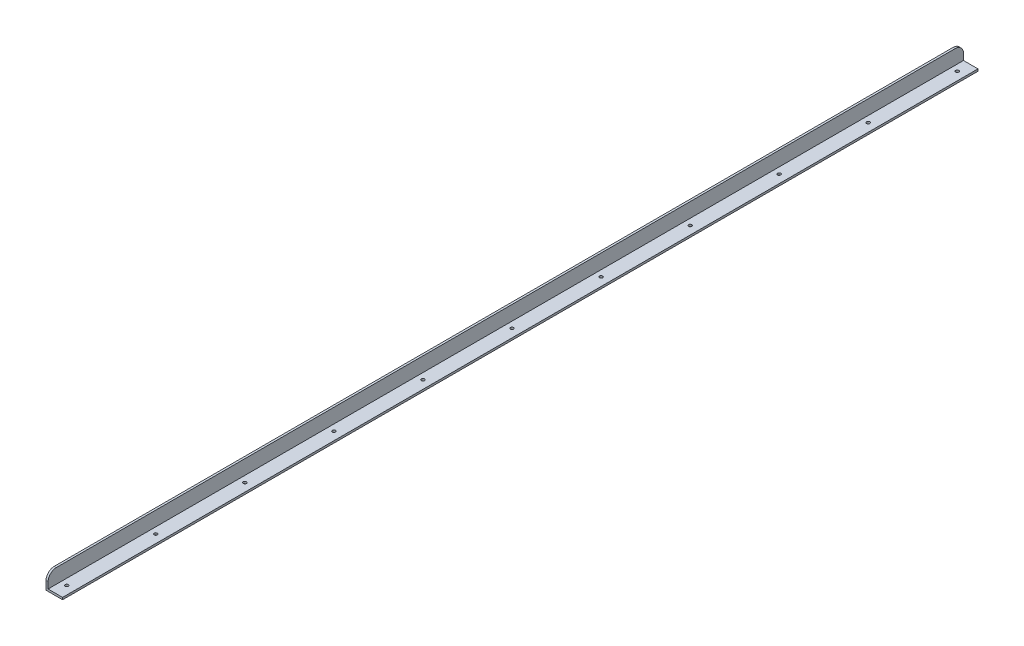
ISO-10303-21;
HEADER;
FILE_DESCRIPTION(('STEP AP214'),'2;1');
FILE_NAME('part.step','',(''),(''),'','','');
FILE_SCHEMA(('AUTOMOTIVE_DESIGN { 1 0 10303 214 1 1 1 1 }'));
ENDSEC;
DATA;
#1=APPLICATION_CONTEXT('core data for automotive mechanical design processes');
#2=APPLICATION_PROTOCOL_DEFINITION('international standard','automotive_design',2000,#1);
#3=PRODUCT_CONTEXT('',#1,'mechanical');
#4=PRODUCT('Part','Part','',(#3));
#5=PRODUCT_RELATED_PRODUCT_CATEGORY('part','',(#4));
#6=PRODUCT_DEFINITION_FORMATION('','',#4);
#7=PRODUCT_DEFINITION_CONTEXT('part definition',#1,'design');
#8=PRODUCT_DEFINITION('design','',#6,#7);
#9=PRODUCT_DEFINITION_SHAPE('','',#8);
#10=(LENGTH_UNIT() NAMED_UNIT(*) SI_UNIT(.MILLI.,.METRE.));
#11=(NAMED_UNIT(*) PLANE_ANGLE_UNIT() SI_UNIT($,.RADIAN.));
#12=(NAMED_UNIT(*) SI_UNIT($,.STERADIAN.) SOLID_ANGLE_UNIT());
#13=UNCERTAINTY_MEASURE_WITH_UNIT(LENGTH_MEASURE(1.E-05),#10,'distance_accuracy_value','');
#14=(GEOMETRIC_REPRESENTATION_CONTEXT(3) GLOBAL_UNCERTAINTY_ASSIGNED_CONTEXT((#13)) GLOBAL_UNIT_ASSIGNED_CONTEXT((#10,
#11,#12)) REPRESENTATION_CONTEXT('',''));
#15=CARTESIAN_POINT('',(0.,0.,0.));
#16=DIRECTION('',(0.,0.,1.));
#17=DIRECTION('',(1.,0.,0.));
#18=AXIS2_PLACEMENT_3D('',#15,#16,#17);
#19=CARTESIAN_POINT('',(25.4000000000001,3.17500000000001,-1403.35));
#20=DIRECTION('',(0.,1.,0.));
#21=DIRECTION('',(-1.,0.,0.));
#22=AXIS2_PLACEMENT_3D('',#19,#20,#21);
#23=PLANE('',#22);
#24=CARTESIAN_POINT('',(12.7,3.17500000000003,-19.05));
#25=DIRECTION('',(0.,1.,0.));
#26=DIRECTION('',(-1.,0.,0.));
#27=AXIS2_PLACEMENT_3D('',#24,#25,#26);
#28=CIRCLE('',#27,2.4257);
#29=CARTESIAN_POINT('',(10.2743,3.17500000000002,-19.05));
#30=VERTEX_POINT('',#29);
#31=EDGE_CURVE('E109',#30,#30,#28,.F.);
#32=ORIENTED_EDGE('',*,*,#31,.T.);
#33=EDGE_LOOP('',(#32));
#34=FACE_BOUND('',#33,.T.);
#35=DIRECTION('',(-1.,0.,0.));
#36=VECTOR('',#35,1.);
#37=CARTESIAN_POINT('',(25.4,3.17500000000001,1.11022302462516E-13));
#38=LINE('',#37,#36);
#39=CARTESIAN_POINT('',(25.4,3.17500000000001,1.11022302462516E-13));
#40=VERTEX_POINT('',#39);
#41=CARTESIAN_POINT('',(3.17499999999998,3.175,1.11022302462516E-13));
#42=VERTEX_POINT('',#41);
#43=EDGE_CURVE('E127',#40,#42,#38,.T.);
#44=ORIENTED_EDGE('',*,*,#43,.F.);
#45=DIRECTION('',(0.,0.,1.));
#46=VECTOR('',#45,1.);
#47=CARTESIAN_POINT('',(25.4000000000001,3.17500000000001,-1403.35));
#48=LINE('',#47,#46);
#49=CARTESIAN_POINT('',(25.4000000000001,3.17500000000001,-1403.35));
#50=VERTEX_POINT('',#49);
#51=EDGE_CURVE('E153',#50,#40,#48,.T.);
#52=ORIENTED_EDGE('',*,*,#51,.F.);
#53=DIRECTION('',(-1.,0.,0.));
#54=VECTOR('',#53,1.);
#55=CARTESIAN_POINT('',(25.4000000000001,3.17500000000001,-1403.35));
#56=LINE('',#55,#54);
#57=CARTESIAN_POINT('',(3.17500000000009,3.17500000000004,-1403.35));
#58=VERTEX_POINT('',#57);
#59=EDGE_CURVE('E141',#50,#58,#56,.T.);
#60=ORIENTED_EDGE('',*,*,#59,.T.);
#61=DIRECTION('',(0.,0.,1.));
#62=VECTOR('',#61,1.);
#63=CARTESIAN_POINT('',(3.17500000000009,3.17500000000004,-1403.35));
#64=LINE('',#63,#62);
#65=EDGE_CURVE('E151',#58,#42,#64,.T.);
#66=ORIENTED_EDGE('',*,*,#65,.T.);
#67=EDGE_LOOP('',(#44,#52,#60,#66));
#68=FACE_BOUND('',#67,.T.);
#69=CARTESIAN_POINT('',(12.7,3.17499999999998,-155.575));
#70=DIRECTION('',(0.,1.,0.));
#71=DIRECTION('',(-1.,0.,0.));
#72=AXIS2_PLACEMENT_3D('',#69,#70,#71);
#73=CIRCLE('',#72,2.4257);
#74=CARTESIAN_POINT('',(10.2743,3.17499999999998,-155.575));
#75=VERTEX_POINT('',#74);
#76=EDGE_CURVE('E242',#75,#75,#73,.F.);
#77=ORIENTED_EDGE('',*,*,#76,.T.);
#78=EDGE_LOOP('',(#77));
#79=FACE_BOUND('',#78,.T.);
#80=CARTESIAN_POINT('',(12.7,3.175,-292.1));
#81=DIRECTION('',(0.,1.,0.));
#82=DIRECTION('',(-1.,0.,0.));
#83=AXIS2_PLACEMENT_3D('',#80,#81,#82);
#84=CIRCLE('',#83,2.4257);
#85=CARTESIAN_POINT('',(10.2743,3.175,-292.1));
#86=VERTEX_POINT('',#85);
#87=EDGE_CURVE('E148',#86,#86,#84,.F.);
#88=ORIENTED_EDGE('',*,*,#87,.T.);
#89=EDGE_LOOP('',(#88));
#90=FACE_BOUND('',#89,.T.);
#91=CARTESIAN_POINT('',(12.7,3.175,-428.625));
#92=DIRECTION('',(0.,1.,0.));
#93=DIRECTION('',(-1.,0.,0.));
#94=AXIS2_PLACEMENT_3D('',#91,#92,#93);
#95=CIRCLE('',#94,2.4257);
#96=CARTESIAN_POINT('',(10.2743,3.175,-428.625));
#97=VERTEX_POINT('',#96);
#98=EDGE_CURVE('E161',#97,#97,#95,.F.);
#99=ORIENTED_EDGE('',*,*,#98,.T.);
#100=EDGE_LOOP('',(#99));
#101=FACE_BOUND('',#100,.T.);
#102=CARTESIAN_POINT('',(12.7,3.17499999999998,-565.15));
#103=DIRECTION('',(0.,1.,0.));
#104=DIRECTION('',(-1.,0.,0.));
#105=AXIS2_PLACEMENT_3D('',#102,#103,#104);
#106=CIRCLE('',#105,2.4257);
#107=CARTESIAN_POINT('',(10.2743,3.17499999999998,-565.15));
#108=VERTEX_POINT('',#107);
#109=EDGE_CURVE('E167',#108,#108,#106,.F.);
#110=ORIENTED_EDGE('',*,*,#109,.T.);
#111=EDGE_LOOP('',(#110));
#112=FACE_BOUND('',#111,.T.);
#113=CARTESIAN_POINT('',(12.7,3.175,-701.675));
#114=DIRECTION('',(0.,1.,0.));
#115=DIRECTION('',(-1.,0.,0.));
#116=AXIS2_PLACEMENT_3D('',#113,#114,#115);
#117=CIRCLE('',#116,2.4257);
#118=CARTESIAN_POINT('',(10.2743,3.175,-701.675));
#119=VERTEX_POINT('',#118);
#120=EDGE_CURVE('E173',#119,#119,#117,.F.);
#121=ORIENTED_EDGE('',*,*,#120,.T.);
#122=EDGE_LOOP('',(#121));
#123=FACE_BOUND('',#122,.T.);
#124=CARTESIAN_POINT('',(12.7,3.17499999999998,-838.2));
#125=DIRECTION('',(0.,1.,0.));
#126=DIRECTION('',(-1.,0.,0.));
#127=AXIS2_PLACEMENT_3D('',#124,#125,#126);
#128=CIRCLE('',#127,2.4257);
#129=CARTESIAN_POINT('',(10.2743,3.17499999999998,-838.2));
#130=VERTEX_POINT('',#129);
#131=EDGE_CURVE('E179',#130,#130,#128,.F.);
#132=ORIENTED_EDGE('',*,*,#131,.T.);
#133=EDGE_LOOP('',(#132));
#134=FACE_BOUND('',#133,.T.);
#135=CARTESIAN_POINT('',(12.7,3.17499999999998,-974.725));
#136=DIRECTION('',(0.,1.,0.));
#137=DIRECTION('',(-1.,0.,0.));
#138=AXIS2_PLACEMENT_3D('',#135,#136,#137);
#139=CIRCLE('',#138,2.4257);
#140=CARTESIAN_POINT('',(10.2743,3.17499999999998,-974.725));
#141=VERTEX_POINT('',#140);
#142=EDGE_CURVE('E185',#141,#141,#139,.F.);
#143=ORIENTED_EDGE('',*,*,#142,.T.);
#144=EDGE_LOOP('',(#143));
#145=FACE_BOUND('',#144,.T.);
#146=CARTESIAN_POINT('',(12.7000000000001,3.17500000000007,-1111.25));
#147=DIRECTION('',(0.,1.,0.));
#148=DIRECTION('',(-1.,0.,0.));
#149=AXIS2_PLACEMENT_3D('',#146,#147,#148);
#150=CIRCLE('',#149,2.4257);
#151=CARTESIAN_POINT('',(10.2743000000001,3.17500000000007,-1111.25));
#152=VERTEX_POINT('',#151);
#153=EDGE_CURVE('E191',#152,#152,#150,.F.);
#154=ORIENTED_EDGE('',*,*,#153,.T.);
#155=EDGE_LOOP('',(#154));
#156=FACE_BOUND('',#155,.T.);
#157=CARTESIAN_POINT('',(12.7000000000001,3.17500000000007,-1247.775));
#158=DIRECTION('',(0.,1.,0.));
#159=DIRECTION('',(-1.,0.,0.));
#160=AXIS2_PLACEMENT_3D('',#157,#158,#159);
#161=CIRCLE('',#160,2.4257);
#162=CARTESIAN_POINT('',(10.2743000000001,3.17500000000007,-1247.775));
#163=VERTEX_POINT('',#162);
#164=EDGE_CURVE('E197',#163,#163,#161,.F.);
#165=ORIENTED_EDGE('',*,*,#164,.T.);
#166=EDGE_LOOP('',(#165));
#167=FACE_BOUND('',#166,.T.);
#168=CARTESIAN_POINT('',(12.7000000000001,3.17500000000004,-1384.3));
#169=DIRECTION('',(0.,1.,0.));
#170=DIRECTION('',(-1.,0.,0.));
#171=AXIS2_PLACEMENT_3D('',#168,#169,#170);
#172=CIRCLE('',#171,2.4257);
#173=CARTESIAN_POINT('',(10.2743000000001,3.17500000000004,-1384.3));
#174=VERTEX_POINT('',#173);
#175=EDGE_CURVE('E203',#174,#174,#172,.F.);
#176=ORIENTED_EDGE('',*,*,#175,.T.);
#177=EDGE_LOOP('',(#176));
#178=FACE_BOUND('',#177,.T.);
#179=ADVANCED_FACE('F32',(#34,#68,#79,#90,#101,#112,#123,#134,#145,#156,#167,#178),#23,.T.);
#180=CARTESIAN_POINT('',(0.,0.,-1403.35));
#181=DIRECTION('',(0.,-1.,0.));
#182=DIRECTION('',(0.,0.,-1.));
#183=AXIS2_PLACEMENT_3D('',#180,#181,#182);
#184=PLANE('',#183);
#185=CARTESIAN_POINT('',(12.7,0.,-19.05));
#186=DIRECTION('',(0.,1.,0.));
#187=DIRECTION('',(0.,0.,1.));
#188=AXIS2_PLACEMENT_3D('',#185,#186,#187);
#189=CIRCLE('',#188,2.4257);
#190=CARTESIAN_POINT('',(12.7,0.,-16.6243));
#191=VERTEX_POINT('',#190);
#192=EDGE_CURVE('E458',#191,#191,#189,.T.);
#193=ORIENTED_EDGE('',*,*,#192,.T.);
#194=EDGE_LOOP('',(#193));
#195=FACE_BOUND('',#194,.T.);
#196=DIRECTION('',(1.,0.,0.));
#197=VECTOR('',#196,1.);
#198=CARTESIAN_POINT('',(0.,0.,0.));
#199=LINE('',#198,#197);
#200=CARTESIAN_POINT('',(0.,0.,0.));
#201=VERTEX_POINT('',#200);
#202=CARTESIAN_POINT('',(25.4,0.,1.11022302462516E-13));
#203=VERTEX_POINT('',#202);
#204=EDGE_CURVE('E106',#201,#203,#199,.T.);
#205=ORIENTED_EDGE('',*,*,#204,.F.);
#206=DIRECTION('',(0.,0.,1.));
#207=VECTOR('',#206,1.);
#208=CARTESIAN_POINT('',(0.,0.,-1403.35));
#209=LINE('',#208,#207);
#210=CARTESIAN_POINT('',(0.,0.,-1403.35));
#211=VERTEX_POINT('',#210);
#212=EDGE_CURVE('E112',#211,#201,#209,.T.);
#213=ORIENTED_EDGE('',*,*,#212,.F.);
#214=DIRECTION('',(1.,0.,0.));
#215=VECTOR('',#214,1.);
#216=CARTESIAN_POINT('',(0.,0.,-1403.35));
#217=LINE('',#216,#215);
#218=CARTESIAN_POINT('',(25.4000000000001,0.,-1403.35));
#219=VERTEX_POINT('',#218);
#220=EDGE_CURVE('E136',#211,#219,#217,.T.);
#221=ORIENTED_EDGE('',*,*,#220,.T.);
#222=DIRECTION('',(0.,0.,1.));
#223=VECTOR('',#222,1.);
#224=CARTESIAN_POINT('',(25.4000000000001,0.,-1403.35));
#225=LINE('',#224,#223);
#226=EDGE_CURVE('E119',#219,#203,#225,.T.);
#227=ORIENTED_EDGE('',*,*,#226,.T.);
#228=EDGE_LOOP('',(#205,#213,#221,#227));
#229=FACE_BOUND('',#228,.T.);
#230=CARTESIAN_POINT('',(12.7,0.,-155.575));
#231=DIRECTION('',(0.,1.,0.));
#232=DIRECTION('',(0.,0.,1.));
#233=AXIS2_PLACEMENT_3D('',#230,#231,#232);
#234=CIRCLE('',#233,2.4257);
#235=CARTESIAN_POINT('',(12.7,0.,-153.1493));
#236=VERTEX_POINT('',#235);
#237=EDGE_CURVE('E459',#236,#236,#234,.T.);
#238=ORIENTED_EDGE('',*,*,#237,.T.);
#239=EDGE_LOOP('',(#238));
#240=FACE_BOUND('',#239,.T.);
#241=CARTESIAN_POINT('',(12.7,0.,-292.1));
#242=DIRECTION('',(0.,1.,0.));
#243=DIRECTION('',(0.,0.,1.));
#244=AXIS2_PLACEMENT_3D('',#241,#242,#243);
#245=CIRCLE('',#244,2.4257);
#246=CARTESIAN_POINT('',(12.7,0.,-289.6743));
#247=VERTEX_POINT('',#246);
#248=EDGE_CURVE('E158',#247,#247,#245,.T.);
#249=ORIENTED_EDGE('',*,*,#248,.T.);
#250=EDGE_LOOP('',(#249));
#251=FACE_BOUND('',#250,.T.);
#252=CARTESIAN_POINT('',(12.7,0.,-428.625));
#253=DIRECTION('',(0.,1.,0.));
#254=DIRECTION('',(0.,0.,1.));
#255=AXIS2_PLACEMENT_3D('',#252,#253,#254);
#256=CIRCLE('',#255,2.4257);
#257=CARTESIAN_POINT('',(12.7,0.,-426.1993));
#258=VERTEX_POINT('',#257);
#259=EDGE_CURVE('E164',#258,#258,#256,.T.);
#260=ORIENTED_EDGE('',*,*,#259,.T.);
#261=EDGE_LOOP('',(#260));
#262=FACE_BOUND('',#261,.T.);
#263=CARTESIAN_POINT('',(12.7,0.,-565.15));
#264=DIRECTION('',(0.,1.,0.));
#265=DIRECTION('',(0.,0.,1.));
#266=AXIS2_PLACEMENT_3D('',#263,#264,#265);
#267=CIRCLE('',#266,2.4257);
#268=CARTESIAN_POINT('',(12.7,0.,-562.7243));
#269=VERTEX_POINT('',#268);
#270=EDGE_CURVE('E170',#269,#269,#267,.T.);
#271=ORIENTED_EDGE('',*,*,#270,.T.);
#272=EDGE_LOOP('',(#271));
#273=FACE_BOUND('',#272,.T.);
#274=CARTESIAN_POINT('',(12.7,0.,-701.675));
#275=DIRECTION('',(0.,1.,0.));
#276=DIRECTION('',(0.,0.,1.));
#277=AXIS2_PLACEMENT_3D('',#274,#275,#276);
#278=CIRCLE('',#277,2.4257);
#279=CARTESIAN_POINT('',(12.7,0.,-699.2493));
#280=VERTEX_POINT('',#279);
#281=EDGE_CURVE('E176',#280,#280,#278,.T.);
#282=ORIENTED_EDGE('',*,*,#281,.T.);
#283=EDGE_LOOP('',(#282));
#284=FACE_BOUND('',#283,.T.);
#285=CARTESIAN_POINT('',(12.7,0.,-838.2));
#286=DIRECTION('',(0.,1.,0.));
#287=DIRECTION('',(0.,0.,1.));
#288=AXIS2_PLACEMENT_3D('',#285,#286,#287);
#289=CIRCLE('',#288,2.4257);
#290=CARTESIAN_POINT('',(12.7,0.,-835.7743));
#291=VERTEX_POINT('',#290);
#292=EDGE_CURVE('E182',#291,#291,#289,.T.);
#293=ORIENTED_EDGE('',*,*,#292,.T.);
#294=EDGE_LOOP('',(#293));
#295=FACE_BOUND('',#294,.T.);
#296=CARTESIAN_POINT('',(12.7,0.,-974.725));
#297=DIRECTION('',(0.,1.,0.));
#298=DIRECTION('',(0.,0.,1.));
#299=AXIS2_PLACEMENT_3D('',#296,#297,#298);
#300=CIRCLE('',#299,2.4257);
#301=CARTESIAN_POINT('',(12.7,0.,-972.2993));
#302=VERTEX_POINT('',#301);
#303=EDGE_CURVE('E188',#302,#302,#300,.T.);
#304=ORIENTED_EDGE('',*,*,#303,.T.);
#305=EDGE_LOOP('',(#304));
#306=FACE_BOUND('',#305,.T.);
#307=CARTESIAN_POINT('',(12.7000000000001,0.,-1111.25));
#308=DIRECTION('',(0.,1.,0.));
#309=DIRECTION('',(0.,0.,1.));
#310=AXIS2_PLACEMENT_3D('',#307,#308,#309);
#311=CIRCLE('',#310,2.4257);
#312=CARTESIAN_POINT('',(12.7000000000001,0.,-1108.8243));
#313=VERTEX_POINT('',#312);
#314=EDGE_CURVE('E194',#313,#313,#311,.T.);
#315=ORIENTED_EDGE('',*,*,#314,.T.);
#316=EDGE_LOOP('',(#315));
#317=FACE_BOUND('',#316,.T.);
#318=CARTESIAN_POINT('',(12.7,0.,-1247.775));
#319=DIRECTION('',(0.,1.,0.));
#320=DIRECTION('',(0.,0.,1.));
#321=AXIS2_PLACEMENT_3D('',#318,#319,#320);
#322=CIRCLE('',#321,2.4257);
#323=CARTESIAN_POINT('',(12.7,0.,-1245.3493));
#324=VERTEX_POINT('',#323);
#325=EDGE_CURVE('E200',#324,#324,#322,.T.);
#326=ORIENTED_EDGE('',*,*,#325,.T.);
#327=EDGE_LOOP('',(#326));
#328=FACE_BOUND('',#327,.T.);
#329=CARTESIAN_POINT('',(12.7000000000001,0.,-1384.3));
#330=DIRECTION('',(0.,1.,0.));
#331=DIRECTION('',(0.,0.,1.));
#332=AXIS2_PLACEMENT_3D('',#329,#330,#331);
#333=CIRCLE('',#332,2.4257);
#334=CARTESIAN_POINT('',(12.7000000000001,0.,-1381.8743));
#335=VERTEX_POINT('',#334);
#336=EDGE_CURVE('E206',#335,#335,#333,.T.);
#337=ORIENTED_EDGE('',*,*,#336,.T.);
#338=EDGE_LOOP('',(#337));
#339=FACE_BOUND('',#338,.T.);
#340=ADVANCED_FACE('F122',(#195,#229,#240,#251,#262,#273,#284,#295,#306,#317,#328,#339),#184,.T.);
#341=CARTESIAN_POINT('',(1.11022302462516E-13,25.4,-1403.35));
#342=DIRECTION('',(-1.,0.,0.));
#343=DIRECTION('',(0.,-1.,0.));
#344=AXIS2_PLACEMENT_3D('',#341,#342,#343);
#345=PLANE('',#344);
#346=DIRECTION('',(0.,0.,1.));
#347=VECTOR('',#346,1.);
#348=CARTESIAN_POINT('',(1.11022302462516E-13,25.4,-1403.35));
#349=LINE('',#348,#347);
#350=CARTESIAN_POINT('',(1.11022302462516E-13,25.4,-1390.65));
#351=VERTEX_POINT('',#350);
#352=CARTESIAN_POINT('',(0.,25.4,-12.6999999999999));
#353=VERTEX_POINT('',#352);
#354=EDGE_CURVE('E145',#351,#353,#349,.T.);
#355=ORIENTED_EDGE('',*,*,#354,.F.);
#356=CARTESIAN_POINT('',(0.,12.7,-1390.65));
#357=DIRECTION('',(-1.,0.,0.));
#358=DIRECTION('',(0.,-1.,0.));
#359=AXIS2_PLACEMENT_3D('',#356,#357,#358);
#360=CIRCLE('',#359,12.7);
#361=CARTESIAN_POINT('',(0.,12.7,-1403.35));
#362=VERTEX_POINT('',#361);
#363=EDGE_CURVE('E216',#351,#362,#360,.T.);
#364=ORIENTED_EDGE('',*,*,#363,.T.);
#365=DIRECTION('',(0.,-1.,0.));
#366=VECTOR('',#365,1.);
#367=CARTESIAN_POINT('',(1.11022302462516E-13,25.4,-1403.35));
#368=LINE('',#367,#366);
#369=EDGE_CURVE('E115',#362,#211,#368,.T.);
#370=ORIENTED_EDGE('',*,*,#369,.T.);
#371=ORIENTED_EDGE('',*,*,#212,.T.);
#372=DIRECTION('',(0.,-1.,0.));
#373=VECTOR('',#372,1.);
#374=CARTESIAN_POINT('',(0.,25.4,0.));
#375=LINE('',#374,#373);
#376=CARTESIAN_POINT('',(0.,12.7,0.));
#377=VERTEX_POINT('',#376);
#378=EDGE_CURVE('E101',#377,#201,#375,.T.);
#379=ORIENTED_EDGE('',*,*,#378,.F.);
#380=CARTESIAN_POINT('',(0.,12.7,-12.7));
#381=DIRECTION('',(-1.,0.,0.));
#382=DIRECTION('',(0.,-1.,0.));
#383=AXIS2_PLACEMENT_3D('',#380,#381,#382);
#384=CIRCLE('',#383,12.7);
#385=EDGE_CURVE('E214',#377,#353,#384,.T.);
#386=ORIENTED_EDGE('',*,*,#385,.T.);
#387=EDGE_LOOP('',(#355,#364,#370,#371,#379,#386));
#388=FACE_BOUND('',#387,.T.);
#389=ADVANCED_FACE('F114',(#388),#345,.T.);
#390=CARTESIAN_POINT('',(3.17500000000007,25.4,-1403.35));
#391=DIRECTION('',(0.,1.,0.));
#392=DIRECTION('',(0.,0.,1.));
#393=AXIS2_PLACEMENT_3D('',#390,#391,#392);
#394=PLANE('',#393);
#395=DIRECTION('',(0.,0.,1.));
#396=VECTOR('',#395,1.);
#397=CARTESIAN_POINT('',(3.17500000000007,25.4,-1403.35));
#398=LINE('',#397,#396);
#399=CARTESIAN_POINT('',(3.17500000000009,25.4,-1390.65));
#400=VERTEX_POINT('',#399);
#401=CARTESIAN_POINT('',(3.17500000000001,25.4,-12.6999999999998));
#402=VERTEX_POINT('',#401);
#403=EDGE_CURVE('E149',#400,#402,#398,.T.);
#404=ORIENTED_EDGE('',*,*,#403,.F.);
#405=DIRECTION('',(-1.,0.,0.));
#406=VECTOR('',#405,1.);
#407=CARTESIAN_POINT('',(1.11022302462516E-13,25.4,-1390.65));
#408=LINE('',#407,#406);
#409=EDGE_CURVE('E211',#400,#351,#408,.T.);
#410=ORIENTED_EDGE('',*,*,#409,.T.);
#411=ORIENTED_EDGE('',*,*,#354,.T.);
#412=DIRECTION('',(-1.,0.,0.));
#413=VECTOR('',#412,1.);
#414=CARTESIAN_POINT('',(3.17500000000001,25.4,-12.6999999999998));
#415=LINE('',#414,#413);
#416=EDGE_CURVE('E209',#353,#402,#415,.F.);
#417=ORIENTED_EDGE('',*,*,#416,.T.);
#418=EDGE_LOOP('',(#404,#410,#411,#417));
#419=FACE_BOUND('',#418,.T.);
#420=ADVANCED_FACE('F225',(#419),#394,.T.);
#421=CARTESIAN_POINT('',(3.17500000000009,3.17500000000004,-1403.35));
#422=DIRECTION('',(1.,0.,0.));
#423=DIRECTION('',(0.,0.,-1.));
#424=AXIS2_PLACEMENT_3D('',#421,#422,#423);
#425=PLANE('',#424);
#426=DIRECTION('',(0.,1.,0.));
#427=VECTOR('',#426,1.);
#428=CARTESIAN_POINT('',(3.17500000000009,3.17500000000004,-1403.35));
#429=LINE('',#428,#427);
#430=CARTESIAN_POINT('',(3.17500000000009,12.7,-1403.35));
#431=VERTEX_POINT('',#430);
#432=EDGE_CURVE('E120',#58,#431,#429,.T.);
#433=ORIENTED_EDGE('',*,*,#432,.T.);
#434=CARTESIAN_POINT('',(3.17500000000012,12.7,-1390.65));
#435=DIRECTION('',(1.,0.,0.));
#436=DIRECTION('',(0.,0.,-1.));
#437=AXIS2_PLACEMENT_3D('',#434,#435,#436);
#438=CIRCLE('',#437,12.7);
#439=EDGE_CURVE('E40',#431,#400,#438,.T.);
#440=ORIENTED_EDGE('',*,*,#439,.T.);
#441=ORIENTED_EDGE('',*,*,#403,.T.);
#442=CARTESIAN_POINT('',(3.17499999999998,12.7,-12.7));
#443=DIRECTION('',(1.,0.,0.));
#444=DIRECTION('',(0.,0.,-1.));
#445=AXIS2_PLACEMENT_3D('',#442,#443,#444);
#446=CIRCLE('',#445,12.7);
#447=CARTESIAN_POINT('',(3.17499999999998,12.7,0.));
#448=VERTEX_POINT('',#447);
#449=EDGE_CURVE('E47',#402,#448,#446,.T.);
#450=ORIENTED_EDGE('',*,*,#449,.T.);
#451=DIRECTION('',(0.,1.,0.));
#452=VECTOR('',#451,1.);
#453=CARTESIAN_POINT('',(3.17499999999998,3.175,1.11022302462516E-13));
#454=LINE('',#453,#452);
#455=EDGE_CURVE('E133',#42,#448,#454,.T.);
#456=ORIENTED_EDGE('',*,*,#455,.F.);
#457=ORIENTED_EDGE('',*,*,#65,.F.);
#458=EDGE_LOOP('',(#433,#440,#441,#450,#456,#457));
#459=FACE_BOUND('',#458,.T.);
#460=ADVANCED_FACE('F221',(#459),#425,.T.);
#461=CARTESIAN_POINT('',(25.4000000000001,0.,-1403.35));
#462=DIRECTION('',(1.,0.,0.));
#463=DIRECTION('',(0.,0.,-1.));
#464=AXIS2_PLACEMENT_3D('',#461,#462,#463);
#465=PLANE('',#464);
#466=DIRECTION('',(0.,1.,0.));
#467=VECTOR('',#466,1.);
#468=CARTESIAN_POINT('',(25.4,0.,1.11022302462516E-13));
#469=LINE('',#468,#467);
#470=EDGE_CURVE('E125',#203,#40,#469,.T.);
#471=ORIENTED_EDGE('',*,*,#470,.F.);
#472=ORIENTED_EDGE('',*,*,#226,.F.);
#473=DIRECTION('',(0.,1.,0.));
#474=VECTOR('',#473,1.);
#475=CARTESIAN_POINT('',(25.4000000000001,0.,-1403.35));
#476=LINE('',#475,#474);
#477=EDGE_CURVE('E138',#219,#50,#476,.T.);
#478=ORIENTED_EDGE('',*,*,#477,.T.);
#479=ORIENTED_EDGE('',*,*,#51,.T.);
#480=EDGE_LOOP('',(#471,#472,#478,#479));
#481=FACE_BOUND('',#480,.T.);
#482=ADVANCED_FACE('F232',(#481),#465,.T.);
#483=CARTESIAN_POINT('',(0.,0.,-1403.35));
#484=DIRECTION('',(0.,0.,1.));
#485=DIRECTION('',(1.,0.,0.));
#486=AXIS2_PLACEMENT_3D('',#483,#484,#485);
#487=PLANE('',#486);
#488=ORIENTED_EDGE('',*,*,#369,.F.);
#489=DIRECTION('',(-1.,0.,0.));
#490=VECTOR('',#489,1.);
#491=CARTESIAN_POINT('',(3.17500000000009,12.7,-1403.35));
#492=LINE('',#491,#490);
#493=EDGE_CURVE('E55',#362,#431,#492,.F.);
#494=ORIENTED_EDGE('',*,*,#493,.T.);
#495=ORIENTED_EDGE('',*,*,#432,.F.);
#496=ORIENTED_EDGE('',*,*,#59,.F.);
#497=ORIENTED_EDGE('',*,*,#477,.F.);
#498=ORIENTED_EDGE('',*,*,#220,.F.);
#499=EDGE_LOOP('',(#488,#494,#495,#496,#497,#498));
#500=FACE_BOUND('',#499,.T.);
#501=ADVANCED_FACE('F228',(#500),#487,.F.);
#502=CARTESIAN_POINT('',(0.,0.,0.));
#503=DIRECTION('',(0.,0.,1.));
#504=DIRECTION('',(1.,0.,0.));
#505=AXIS2_PLACEMENT_3D('',#502,#503,#504);
#506=PLANE('',#505);
#507=ORIENTED_EDGE('',*,*,#455,.T.);
#508=DIRECTION('',(-1.,0.,0.));
#509=VECTOR('',#508,1.);
#510=CARTESIAN_POINT('',(0.,12.7,0.));
#511=LINE('',#510,#509);
#512=EDGE_CURVE('E11',#448,#377,#511,.T.);
#513=ORIENTED_EDGE('',*,*,#512,.T.);
#514=ORIENTED_EDGE('',*,*,#378,.T.);
#515=ORIENTED_EDGE('',*,*,#204,.T.);
#516=ORIENTED_EDGE('',*,*,#470,.T.);
#517=ORIENTED_EDGE('',*,*,#43,.T.);
#518=EDGE_LOOP('',(#507,#513,#514,#515,#516,#517));
#519=FACE_BOUND('',#518,.T.);
#520=ADVANCED_FACE('F103',(#519),#506,.T.);
#521=CARTESIAN_POINT('',(12.7,25.4,-19.0499999999999));
#522=DIRECTION('',(0.,-1.,0.));
#523=DIRECTION('',(0.,0.,-1.));
#524=AXIS2_PLACEMENT_3D('',#521,#522,#523);
#525=CYLINDRICAL_SURFACE('',#524,2.4257);
#526=ORIENTED_EDGE('',*,*,#31,.F.);
#527=EDGE_LOOP('',(#526));
#528=FACE_BOUND('',#527,.T.);
#529=ORIENTED_EDGE('',*,*,#192,.F.);
#530=EDGE_LOOP('',(#529));
#531=FACE_BOUND('',#530,.T.);
#532=ADVANCED_FACE('F381',(#528,#531),#525,.F.);
#533=CARTESIAN_POINT('',(12.7,25.4,-155.575));
#534=DIRECTION('',(0.,-1.,0.));
#535=DIRECTION('',(0.,0.,-1.));
#536=AXIS2_PLACEMENT_3D('',#533,#534,#535);
#537=CYLINDRICAL_SURFACE('',#536,2.4257);
#538=ORIENTED_EDGE('',*,*,#76,.F.);
#539=EDGE_LOOP('',(#538));
#540=FACE_BOUND('',#539,.T.);
#541=ORIENTED_EDGE('',*,*,#237,.F.);
#542=EDGE_LOOP('',(#541));
#543=FACE_BOUND('',#542,.T.);
#544=ADVANCED_FACE('F280',(#540,#543),#537,.F.);
#545=CARTESIAN_POINT('',(12.7,25.4,-292.1));
#546=DIRECTION('',(0.,-1.,0.));
#547=DIRECTION('',(0.,0.,-1.));
#548=AXIS2_PLACEMENT_3D('',#545,#546,#547);
#549=CYLINDRICAL_SURFACE('',#548,2.4257);
#550=ORIENTED_EDGE('',*,*,#87,.F.);
#551=EDGE_LOOP('',(#550));
#552=FACE_BOUND('',#551,.T.);
#553=ORIENTED_EDGE('',*,*,#248,.F.);
#554=EDGE_LOOP('',(#553));
#555=FACE_BOUND('',#554,.T.);
#556=ADVANCED_FACE('F276',(#552,#555),#549,.F.);
#557=CARTESIAN_POINT('',(12.7,25.4,-428.625));
#558=DIRECTION('',(0.,-1.,0.));
#559=DIRECTION('',(0.,0.,-1.));
#560=AXIS2_PLACEMENT_3D('',#557,#558,#559);
#561=CYLINDRICAL_SURFACE('',#560,2.4257);
#562=ORIENTED_EDGE('',*,*,#98,.F.);
#563=EDGE_LOOP('',(#562));
#564=FACE_BOUND('',#563,.T.);
#565=ORIENTED_EDGE('',*,*,#259,.F.);
#566=EDGE_LOOP('',(#565));
#567=FACE_BOUND('',#566,.T.);
#568=ADVANCED_FACE('F279',(#564,#567),#561,.F.);
#569=CARTESIAN_POINT('',(12.7,25.4,-565.15));
#570=DIRECTION('',(0.,-1.,0.));
#571=DIRECTION('',(0.,0.,-1.));
#572=AXIS2_PLACEMENT_3D('',#569,#570,#571);
#573=CYLINDRICAL_SURFACE('',#572,2.4257);
#574=ORIENTED_EDGE('',*,*,#109,.F.);
#575=EDGE_LOOP('',(#574));
#576=FACE_BOUND('',#575,.T.);
#577=ORIENTED_EDGE('',*,*,#270,.F.);
#578=EDGE_LOOP('',(#577));
#579=FACE_BOUND('',#578,.T.);
#580=ADVANCED_FACE('F284',(#576,#579),#573,.F.);
#581=CARTESIAN_POINT('',(12.7,25.4,-701.675));
#582=DIRECTION('',(0.,-1.,0.));
#583=DIRECTION('',(0.,0.,-1.));
#584=AXIS2_PLACEMENT_3D('',#581,#582,#583);
#585=CYLINDRICAL_SURFACE('',#584,2.4257);
#586=ORIENTED_EDGE('',*,*,#120,.F.);
#587=EDGE_LOOP('',(#586));
#588=FACE_BOUND('',#587,.T.);
#589=ORIENTED_EDGE('',*,*,#281,.F.);
#590=EDGE_LOOP('',(#589));
#591=FACE_BOUND('',#590,.T.);
#592=ADVANCED_FACE('F288',(#588,#591),#585,.F.);
#593=CARTESIAN_POINT('',(12.7,25.4,-838.2));
#594=DIRECTION('',(0.,-1.,0.));
#595=DIRECTION('',(0.,0.,-1.));
#596=AXIS2_PLACEMENT_3D('',#593,#594,#595);
#597=CYLINDRICAL_SURFACE('',#596,2.4257);
#598=ORIENTED_EDGE('',*,*,#131,.F.);
#599=EDGE_LOOP('',(#598));
#600=FACE_BOUND('',#599,.T.);
#601=ORIENTED_EDGE('',*,*,#292,.F.);
#602=EDGE_LOOP('',(#601));
#603=FACE_BOUND('',#602,.T.);
#604=ADVANCED_FACE('F292',(#600,#603),#597,.F.);
#605=CARTESIAN_POINT('',(12.7,25.4,-974.725));
#606=DIRECTION('',(0.,-1.,0.));
#607=DIRECTION('',(0.,0.,-1.));
#608=AXIS2_PLACEMENT_3D('',#605,#606,#607);
#609=CYLINDRICAL_SURFACE('',#608,2.4257);
#610=ORIENTED_EDGE('',*,*,#142,.F.);
#611=EDGE_LOOP('',(#610));
#612=FACE_BOUND('',#611,.T.);
#613=ORIENTED_EDGE('',*,*,#303,.F.);
#614=EDGE_LOOP('',(#613));
#615=FACE_BOUND('',#614,.T.);
#616=ADVANCED_FACE('F296',(#612,#615),#609,.F.);
#617=CARTESIAN_POINT('',(12.7000000000001,25.4,-1111.25));
#618=DIRECTION('',(0.,-1.,0.));
#619=DIRECTION('',(0.,0.,-1.));
#620=AXIS2_PLACEMENT_3D('',#617,#618,#619);
#621=CYLINDRICAL_SURFACE('',#620,2.4257);
#622=ORIENTED_EDGE('',*,*,#153,.F.);
#623=EDGE_LOOP('',(#622));
#624=FACE_BOUND('',#623,.T.);
#625=ORIENTED_EDGE('',*,*,#314,.F.);
#626=EDGE_LOOP('',(#625));
#627=FACE_BOUND('',#626,.T.);
#628=ADVANCED_FACE('F300',(#624,#627),#621,.F.);
#629=CARTESIAN_POINT('',(12.7000000000001,25.4,-1247.775));
#630=DIRECTION('',(0.,-1.,0.));
#631=DIRECTION('',(0.,0.,-1.));
#632=AXIS2_PLACEMENT_3D('',#629,#630,#631);
#633=CYLINDRICAL_SURFACE('',#632,2.4257);
#634=ORIENTED_EDGE('',*,*,#164,.F.);
#635=EDGE_LOOP('',(#634));
#636=FACE_BOUND('',#635,.T.);
#637=ORIENTED_EDGE('',*,*,#325,.F.);
#638=EDGE_LOOP('',(#637));
#639=FACE_BOUND('',#638,.T.);
#640=ADVANCED_FACE('F263',(#636,#639),#633,.F.);
#641=CARTESIAN_POINT('',(12.7000000000001,25.4,-1384.3));
#642=DIRECTION('',(0.,-1.,0.));
#643=DIRECTION('',(0.,0.,-1.));
#644=AXIS2_PLACEMENT_3D('',#641,#642,#643);
#645=CYLINDRICAL_SURFACE('',#644,2.4257);
#646=ORIENTED_EDGE('',*,*,#175,.F.);
#647=EDGE_LOOP('',(#646));
#648=FACE_BOUND('',#647,.T.);
#649=ORIENTED_EDGE('',*,*,#336,.F.);
#650=EDGE_LOOP('',(#649));
#651=FACE_BOUND('',#650,.T.);
#652=ADVANCED_FACE('F34',(#648,#651),#645,.F.);
#653=CARTESIAN_POINT('',(3.17500000000012,12.7,-1390.65));
#654=DIRECTION('',(1.,0.,0.));
#655=DIRECTION('',(0.,0.,-1.));
#656=AXIS2_PLACEMENT_3D('',#653,#654,#655);
#657=CYLINDRICAL_SURFACE('',#656,12.7);
#658=ORIENTED_EDGE('',*,*,#439,.F.);
#659=ORIENTED_EDGE('',*,*,#493,.F.);
#660=ORIENTED_EDGE('',*,*,#363,.F.);
#661=ORIENTED_EDGE('',*,*,#409,.F.);
#662=EDGE_LOOP('',(#658,#659,#660,#661));
#663=FACE_BOUND('',#662,.T.);
#664=ADVANCED_FACE('F227',(#663),#657,.T.);
#665=CARTESIAN_POINT('',(0.,12.7,-12.7));
#666=DIRECTION('',(-1.,0.,0.));
#667=DIRECTION('',(0.,0.,1.));
#668=AXIS2_PLACEMENT_3D('',#665,#666,#667);
#669=CYLINDRICAL_SURFACE('',#668,12.7);
#670=ORIENTED_EDGE('',*,*,#449,.F.);
#671=ORIENTED_EDGE('',*,*,#416,.F.);
#672=ORIENTED_EDGE('',*,*,#385,.F.);
#673=ORIENTED_EDGE('',*,*,#512,.F.);
#674=EDGE_LOOP('',(#670,#671,#672,#673));
#675=FACE_BOUND('',#674,.T.);
#676=ADVANCED_FACE('F323',(#675),#669,.T.);
#677=CLOSED_SHELL('',(#179,#340,#389,#420,#460,#482,#501,#520,#532,#544,#556,#568,#580,#592,
#604,#616,#628,#640,#652,#664,#676));
#678=MANIFOLD_SOLID_BREP('B2',#677);
#679=ADVANCED_BREP_SHAPE_REPRESENTATION('',(#18,#678),#14);
#680=SHAPE_DEFINITION_REPRESENTATION(#9,#679);
ENDSEC;
END-ISO-10303-21;
